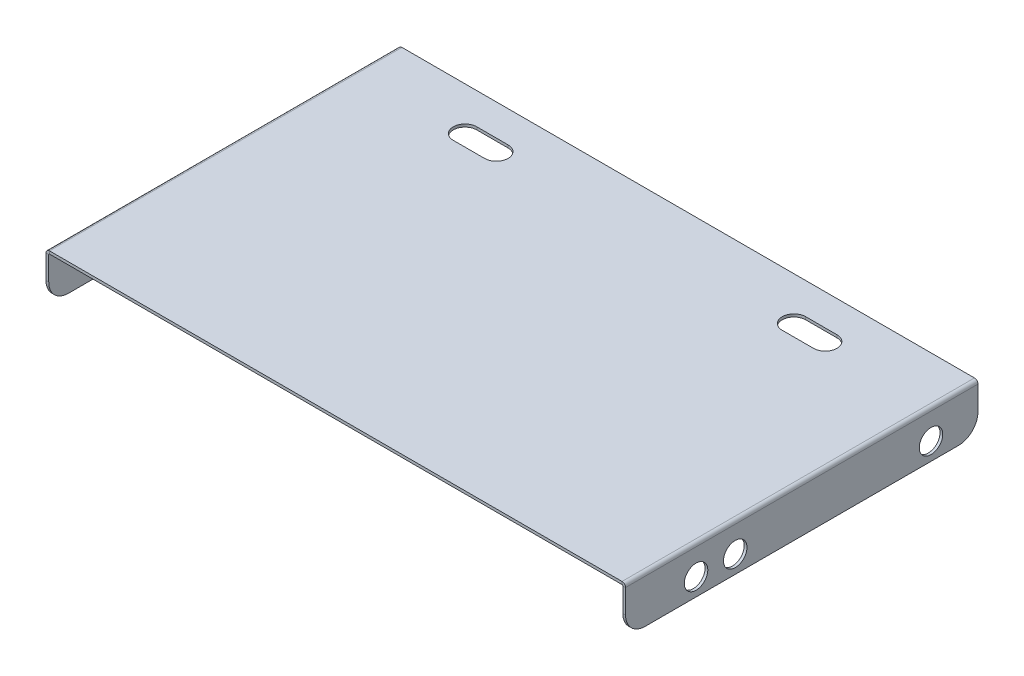
ISO-10303-21;
HEADER;
FILE_DESCRIPTION(('STEP AP214'),'2;1');
FILE_NAME('part.step','',(''),(''),'','','');
FILE_SCHEMA(('AUTOMOTIVE_DESIGN { 1 0 10303 214 1 1 1 1 }'));
ENDSEC;
DATA;
#1=APPLICATION_CONTEXT('core data for automotive mechanical design processes');
#2=APPLICATION_PROTOCOL_DEFINITION('international standard','automotive_design',2000,#1);
#3=PRODUCT_CONTEXT('',#1,'mechanical');
#4=PRODUCT('Part','Part','',(#3));
#5=PRODUCT_RELATED_PRODUCT_CATEGORY('part','',(#4));
#6=PRODUCT_DEFINITION_FORMATION('','',#4);
#7=PRODUCT_DEFINITION_CONTEXT('part definition',#1,'design');
#8=PRODUCT_DEFINITION('design','',#6,#7);
#9=PRODUCT_DEFINITION_SHAPE('','',#8);
#10=(LENGTH_UNIT() NAMED_UNIT(*) SI_UNIT(.MILLI.,.METRE.));
#11=(NAMED_UNIT(*) PLANE_ANGLE_UNIT() SI_UNIT($,.RADIAN.));
#12=(NAMED_UNIT(*) SI_UNIT($,.STERADIAN.) SOLID_ANGLE_UNIT());
#13=UNCERTAINTY_MEASURE_WITH_UNIT(LENGTH_MEASURE(1.E-05),#10,'distance_accuracy_value','');
#14=(GEOMETRIC_REPRESENTATION_CONTEXT(3) GLOBAL_UNCERTAINTY_ASSIGNED_CONTEXT((#13)) GLOBAL_UNIT_ASSIGNED_CONTEXT((#10,
#11,#12)) REPRESENTATION_CONTEXT('',''));
#15=CARTESIAN_POINT('',(0.,0.,0.));
#16=DIRECTION('',(0.,0.,1.));
#17=DIRECTION('',(1.,0.,0.));
#18=AXIS2_PLACEMENT_3D('',#15,#16,#17);
#19=CARTESIAN_POINT('',(0.,-0.7,0.));
#20=DIRECTION('',(0.,1.,0.));
#21=DIRECTION('',(0.,0.,1.));
#22=AXIS2_PLACEMENT_3D('',#19,#20,#21);
#23=PLANE('',#22);
#24=DIRECTION('',(-1.,0.,0.));
#25=VECTOR('',#24,1.);
#26=CARTESIAN_POINT('',(38.,-0.7,-37.));
#27=LINE('',#26,#25);
#28=CARTESIAN_POINT('',(46.,-0.7,-37.));
#29=VERTEX_POINT('',#28);
#30=CARTESIAN_POINT('',(38.,-0.7,-37.));
#31=VERTEX_POINT('',#30);
#32=EDGE_CURVE('E433',#29,#31,#27,.T.);
#33=ORIENTED_EDGE('',*,*,#32,.T.);
#34=CARTESIAN_POINT('',(38.,-0.7,-34.));
#35=DIRECTION('',(0.,1.,0.));
#36=DIRECTION('',(0.,0.,1.));
#37=AXIS2_PLACEMENT_3D('',#34,#35,#36);
#38=CIRCLE('',#37,3.);
#39=CARTESIAN_POINT('',(38.,-0.7,-31.));
#40=VERTEX_POINT('',#39);
#41=EDGE_CURVE('E420',#31,#40,#38,.T.);
#42=ORIENTED_EDGE('',*,*,#41,.T.);
#43=DIRECTION('',(1.,0.,0.));
#44=VECTOR('',#43,1.);
#45=CARTESIAN_POINT('',(38.,-0.7,-31.));
#46=LINE('',#45,#44);
#47=CARTESIAN_POINT('',(46.,-0.7,-31.));
#48=VERTEX_POINT('',#47);
#49=EDGE_CURVE('E424',#40,#48,#46,.T.);
#50=ORIENTED_EDGE('',*,*,#49,.T.);
#51=CARTESIAN_POINT('',(46.,-0.7,-34.));
#52=DIRECTION('',(0.,1.,0.));
#53=DIRECTION('',(0.,0.,1.));
#54=AXIS2_PLACEMENT_3D('',#51,#52,#53);
#55=CIRCLE('',#54,3.);
#56=EDGE_CURVE('E429',#48,#29,#55,.T.);
#57=ORIENTED_EDGE('',*,*,#56,.T.);
#58=EDGE_LOOP('',(#33,#42,#50,#57));
#59=FACE_BOUND('',#58,.T.);
#60=DIRECTION('',(-1.,0.,0.));
#61=VECTOR('',#60,1.);
#62=CARTESIAN_POINT('',(-46.,-0.7,-37.));
#63=LINE('',#62,#61);
#64=CARTESIAN_POINT('',(-38.,-0.7,-37.));
#65=VERTEX_POINT('',#64);
#66=CARTESIAN_POINT('',(-46.,-0.7,-37.));
#67=VERTEX_POINT('',#66);
#68=EDGE_CURVE('E477',#65,#67,#63,.T.);
#69=ORIENTED_EDGE('',*,*,#68,.T.);
#70=CARTESIAN_POINT('',(-46.,-0.7,-34.));
#71=DIRECTION('',(0.,1.,0.));
#72=DIRECTION('',(0.,0.,1.));
#73=AXIS2_PLACEMENT_3D('',#70,#71,#72);
#74=CIRCLE('',#73,3.00000000000001);
#75=CARTESIAN_POINT('',(-46.,-0.7,-31.));
#76=VERTEX_POINT('',#75);
#77=EDGE_CURVE('E464',#67,#76,#74,.T.);
#78=ORIENTED_EDGE('',*,*,#77,.T.);
#79=DIRECTION('',(1.,0.,0.));
#80=VECTOR('',#79,1.);
#81=CARTESIAN_POINT('',(-46.,-0.7,-31.));
#82=LINE('',#81,#80);
#83=CARTESIAN_POINT('',(-38.,-0.7,-31.));
#84=VERTEX_POINT('',#83);
#85=EDGE_CURVE('E468',#76,#84,#82,.T.);
#86=ORIENTED_EDGE('',*,*,#85,.T.);
#87=CARTESIAN_POINT('',(-38.,-0.7,-34.));
#88=DIRECTION('',(0.,1.,0.));
#89=DIRECTION('',(0.,0.,1.));
#90=AXIS2_PLACEMENT_3D('',#87,#88,#89);
#91=CIRCLE('',#90,3.00000000000001);
#92=EDGE_CURVE('E473',#84,#65,#91,.T.);
#93=ORIENTED_EDGE('',*,*,#92,.T.);
#94=EDGE_LOOP('',(#69,#78,#86,#93));
#95=FACE_BOUND('',#94,.T.);
#96=DIRECTION('',(0.,0.,-1.));
#97=VECTOR('',#96,1.);
#98=CARTESIAN_POINT('',(-73.1,-0.700000000000007,-45.));
#99=LINE('',#98,#97);
#100=CARTESIAN_POINT('',(-73.1,-0.700000000000007,-45.));
#101=VERTEX_POINT('',#100);
#102=CARTESIAN_POINT('',(-73.1,-0.700000000000007,45.));
#103=VERTEX_POINT('',#102);
#104=EDGE_CURVE('E316',#101,#103,#99,.F.);
#105=ORIENTED_EDGE('',*,*,#104,.F.);
#106=DIRECTION('',(-1.,0.,0.));
#107=VECTOR('',#106,1.);
#108=CARTESIAN_POINT('',(-74.,-0.7,-45.));
#109=LINE('',#108,#107);
#110=CARTESIAN_POINT('',(73.1,-0.700000000000021,-45.));
#111=VERTEX_POINT('',#110);
#112=EDGE_CURVE('E508',#111,#101,#109,.T.);
#113=ORIENTED_EDGE('',*,*,#112,.F.);
#114=DIRECTION('',(0.,0.,1.));
#115=VECTOR('',#114,1.);
#116=CARTESIAN_POINT('',(73.1,-0.700000000000021,45.));
#117=LINE('',#116,#115);
#118=CARTESIAN_POINT('',(73.1,-0.700000000000021,45.));
#119=VERTEX_POINT('',#118);
#120=EDGE_CURVE('E406',#119,#111,#117,.F.);
#121=ORIENTED_EDGE('',*,*,#120,.F.);
#122=DIRECTION('',(1.,0.,0.));
#123=VECTOR('',#122,1.);
#124=CARTESIAN_POINT('',(-74.,-0.7,45.));
#125=LINE('',#124,#123);
#126=EDGE_CURVE('E512',#103,#119,#125,.T.);
#127=ORIENTED_EDGE('',*,*,#126,.F.);
#128=EDGE_LOOP('',(#105,#113,#121,#127));
#129=FACE_BOUND('',#128,.T.);
#130=ADVANCED_FACE('F87',(#59,#95,#129),#23,.F.);
#131=CARTESIAN_POINT('',(0.,0.,0.));
#132=DIRECTION('',(0.,1.,0.));
#133=DIRECTION('',(0.,0.,1.));
#134=AXIS2_PLACEMENT_3D('',#131,#132,#133);
#135=PLANE('',#134);
#136=CARTESIAN_POINT('',(38.,0.,-34.));
#137=DIRECTION('',(0.,1.,0.));
#138=DIRECTION('',(0.,0.,1.));
#139=AXIS2_PLACEMENT_3D('',#136,#137,#138);
#140=CIRCLE('',#139,3.);
#141=CARTESIAN_POINT('',(38.,0.,-37.));
#142=VERTEX_POINT('',#141);
#143=CARTESIAN_POINT('',(38.,0.,-31.));
#144=VERTEX_POINT('',#143);
#145=EDGE_CURVE('E416',#142,#144,#140,.T.);
#146=ORIENTED_EDGE('',*,*,#145,.F.);
#147=DIRECTION('',(-1.,0.,0.));
#148=VECTOR('',#147,1.);
#149=CARTESIAN_POINT('',(38.,0.,-37.));
#150=LINE('',#149,#148);
#151=CARTESIAN_POINT('',(46.,0.,-37.));
#152=VERTEX_POINT('',#151);
#153=EDGE_CURVE('E425',#152,#142,#150,.T.);
#154=ORIENTED_EDGE('',*,*,#153,.F.);
#155=CARTESIAN_POINT('',(46.,0.,-34.));
#156=DIRECTION('',(0.,1.,0.));
#157=DIRECTION('',(0.,0.,1.));
#158=AXIS2_PLACEMENT_3D('',#155,#156,#157);
#159=CIRCLE('',#158,3.);
#160=CARTESIAN_POINT('',(46.,0.,-31.));
#161=VERTEX_POINT('',#160);
#162=EDGE_CURVE('E444',#161,#152,#159,.T.);
#163=ORIENTED_EDGE('',*,*,#162,.F.);
#164=DIRECTION('',(1.,0.,0.));
#165=VECTOR('',#164,1.);
#166=CARTESIAN_POINT('',(38.,0.,-31.));
#167=LINE('',#166,#165);
#168=EDGE_CURVE('E440',#144,#161,#167,.T.);
#169=ORIENTED_EDGE('',*,*,#168,.F.);
#170=EDGE_LOOP('',(#146,#154,#163,#169));
#171=FACE_BOUND('',#170,.T.);
#172=CARTESIAN_POINT('',(-46.,0.,-34.));
#173=DIRECTION('',(0.,1.,0.));
#174=DIRECTION('',(0.,0.,1.));
#175=AXIS2_PLACEMENT_3D('',#172,#173,#174);
#176=CIRCLE('',#175,3.00000000000001);
#177=CARTESIAN_POINT('',(-46.,0.,-37.));
#178=VERTEX_POINT('',#177);
#179=CARTESIAN_POINT('',(-46.,0.,-31.));
#180=VERTEX_POINT('',#179);
#181=EDGE_CURVE('E454',#178,#180,#176,.T.);
#182=ORIENTED_EDGE('',*,*,#181,.F.);
#183=DIRECTION('',(-1.,0.,0.));
#184=VECTOR('',#183,1.);
#185=CARTESIAN_POINT('',(-46.,0.,-37.));
#186=LINE('',#185,#184);
#187=CARTESIAN_POINT('',(-38.,0.,-37.));
#188=VERTEX_POINT('',#187);
#189=EDGE_CURVE('E469',#188,#178,#186,.T.);
#190=ORIENTED_EDGE('',*,*,#189,.F.);
#191=CARTESIAN_POINT('',(-38.,0.,-34.));
#192=DIRECTION('',(0.,1.,0.));
#193=DIRECTION('',(0.,0.,1.));
#194=AXIS2_PLACEMENT_3D('',#191,#192,#193);
#195=CIRCLE('',#194,3.00000000000001);
#196=CARTESIAN_POINT('',(-38.,0.,-31.));
#197=VERTEX_POINT('',#196);
#198=EDGE_CURVE('E488',#197,#188,#195,.T.);
#199=ORIENTED_EDGE('',*,*,#198,.F.);
#200=DIRECTION('',(1.,0.,0.));
#201=VECTOR('',#200,1.);
#202=CARTESIAN_POINT('',(-46.,0.,-31.));
#203=LINE('',#202,#201);
#204=EDGE_CURVE('E484',#180,#197,#203,.T.);
#205=ORIENTED_EDGE('',*,*,#204,.F.);
#206=EDGE_LOOP('',(#182,#190,#199,#205));
#207=FACE_BOUND('',#206,.T.);
#208=DIRECTION('',(-1.,0.,0.));
#209=VECTOR('',#208,1.);
#210=CARTESIAN_POINT('',(-74.,0.,-45.));
#211=LINE('',#210,#209);
#212=CARTESIAN_POINT('',(73.1,0.,-45.));
#213=VERTEX_POINT('',#212);
#214=CARTESIAN_POINT('',(-73.1,0.,-45.));
#215=VERTEX_POINT('',#214);
#216=EDGE_CURVE('E498',#213,#215,#211,.T.);
#217=ORIENTED_EDGE('',*,*,#216,.T.);
#218=DIRECTION('',(0.,0.,-1.));
#219=VECTOR('',#218,1.);
#220=CARTESIAN_POINT('',(-73.1,0.,-45.));
#221=LINE('',#220,#219);
#222=CARTESIAN_POINT('',(-73.1,0.,45.));
#223=VERTEX_POINT('',#222);
#224=EDGE_CURVE('E260',#215,#223,#221,.F.);
#225=ORIENTED_EDGE('',*,*,#224,.T.);
#226=DIRECTION('',(1.,0.,0.));
#227=VECTOR('',#226,1.);
#228=CARTESIAN_POINT('',(-74.,0.,45.));
#229=LINE('',#228,#227);
#230=CARTESIAN_POINT('',(73.1,0.,45.));
#231=VERTEX_POINT('',#230);
#232=EDGE_CURVE('E513',#223,#231,#229,.T.);
#233=ORIENTED_EDGE('',*,*,#232,.T.);
#234=DIRECTION('',(0.,0.,1.));
#235=VECTOR('',#234,1.);
#236=CARTESIAN_POINT('',(73.1,0.,45.));
#237=LINE('',#236,#235);
#238=EDGE_CURVE('E389',#231,#213,#237,.F.);
#239=ORIENTED_EDGE('',*,*,#238,.T.);
#240=EDGE_LOOP('',(#217,#225,#233,#239));
#241=FACE_BOUND('',#240,.T.);
#242=ADVANCED_FACE('F621',(#171,#207,#241),#135,.T.);
#243=CARTESIAN_POINT('',(-74.,-0.7,-45.));
#244=DIRECTION('',(0.,0.,-1.));
#245=DIRECTION('',(-1.,0.,0.));
#246=AXIS2_PLACEMENT_3D('',#243,#244,#245);
#247=PLANE('',#246);
#248=ORIENTED_EDGE('',*,*,#112,.T.);
#249=DIRECTION('',(0.,1.,0.));
#250=VECTOR('',#249,1.);
#251=CARTESIAN_POINT('',(-73.1,-0.700000000000007,-45.));
#252=LINE('',#251,#250);
#253=EDGE_CURVE('E311',#101,#215,#252,.T.);
#254=ORIENTED_EDGE('',*,*,#253,.T.);
#255=ORIENTED_EDGE('',*,*,#216,.F.);
#256=DIRECTION('',(0.,1.,0.));
#257=VECTOR('',#256,1.);
#258=CARTESIAN_POINT('',(73.1,-0.700000000000021,-45.));
#259=LINE('',#258,#257);
#260=EDGE_CURVE('E412',#111,#213,#259,.T.);
#261=ORIENTED_EDGE('',*,*,#260,.F.);
#262=EDGE_LOOP('',(#248,#254,#255,#261));
#263=FACE_BOUND('',#262,.T.);
#264=ADVANCED_FACE('F614',(#263),#247,.T.);
#265=CARTESIAN_POINT('',(-74.,-0.7,45.));
#266=DIRECTION('',(0.,0.,1.));
#267=DIRECTION('',(1.,0.,0.));
#268=AXIS2_PLACEMENT_3D('',#265,#266,#267);
#269=PLANE('',#268);
#270=DIRECTION('',(0.,1.,0.));
#271=VECTOR('',#270,1.);
#272=CARTESIAN_POINT('',(-73.1,-0.700000000000007,45.));
#273=LINE('',#272,#271);
#274=EDGE_CURVE('E321',#103,#223,#273,.T.);
#275=ORIENTED_EDGE('',*,*,#274,.F.);
#276=ORIENTED_EDGE('',*,*,#126,.T.);
#277=DIRECTION('',(0.,1.,0.));
#278=VECTOR('',#277,1.);
#279=CARTESIAN_POINT('',(73.1,-0.700000000000021,45.));
#280=LINE('',#279,#278);
#281=EDGE_CURVE('E398',#119,#231,#280,.T.);
#282=ORIENTED_EDGE('',*,*,#281,.T.);
#283=ORIENTED_EDGE('',*,*,#232,.F.);
#284=EDGE_LOOP('',(#275,#276,#282,#283));
#285=FACE_BOUND('',#284,.T.);
#286=ADVANCED_FACE('F684',(#285),#269,.T.);
#287=CARTESIAN_POINT('',(-46.,-0.7,-34.));
#288=DIRECTION('',(0.,1.,0.));
#289=DIRECTION('',(0.,0.,1.));
#290=AXIS2_PLACEMENT_3D('',#287,#288,#289);
#291=CYLINDRICAL_SURFACE('',#290,3.00000000000001);
#292=ORIENTED_EDGE('',*,*,#181,.T.);
#293=DIRECTION('',(0.,1.,0.));
#294=VECTOR('',#293,1.);
#295=CARTESIAN_POINT('',(-46.,-0.7,-31.));
#296=LINE('',#295,#294);
#297=EDGE_CURVE('E481',#76,#180,#296,.T.);
#298=ORIENTED_EDGE('',*,*,#297,.F.);
#299=ORIENTED_EDGE('',*,*,#77,.F.);
#300=DIRECTION('',(0.,1.,0.));
#301=VECTOR('',#300,1.);
#302=CARTESIAN_POINT('',(-46.,-0.7,-37.));
#303=LINE('',#302,#301);
#304=EDGE_CURVE('E495',#67,#178,#303,.T.);
#305=ORIENTED_EDGE('',*,*,#304,.T.);
#306=EDGE_LOOP('',(#292,#298,#299,#305));
#307=FACE_BOUND('',#306,.T.);
#308=ADVANCED_FACE('F681',(#307),#291,.F.);
#309=CARTESIAN_POINT('',(-46.,-0.7,-37.));
#310=DIRECTION('',(0.,0.,-1.));
#311=DIRECTION('',(-1.,0.,0.));
#312=AXIS2_PLACEMENT_3D('',#309,#310,#311);
#313=PLANE('',#312);
#314=ORIENTED_EDGE('',*,*,#189,.T.);
#315=ORIENTED_EDGE('',*,*,#304,.F.);
#316=ORIENTED_EDGE('',*,*,#68,.F.);
#317=DIRECTION('',(0.,1.,0.));
#318=VECTOR('',#317,1.);
#319=CARTESIAN_POINT('',(-38.,-0.7,-37.));
#320=LINE('',#319,#318);
#321=EDGE_CURVE('E499',#65,#188,#320,.T.);
#322=ORIENTED_EDGE('',*,*,#321,.T.);
#323=EDGE_LOOP('',(#314,#315,#316,#322));
#324=FACE_BOUND('',#323,.T.);
#325=ADVANCED_FACE('F798',(#324),#313,.F.);
#326=CARTESIAN_POINT('',(-38.,-0.7,-34.));
#327=DIRECTION('',(0.,1.,0.));
#328=DIRECTION('',(0.,0.,1.));
#329=AXIS2_PLACEMENT_3D('',#326,#327,#328);
#330=CYLINDRICAL_SURFACE('',#329,3.00000000000001);
#331=ORIENTED_EDGE('',*,*,#198,.T.);
#332=ORIENTED_EDGE('',*,*,#321,.F.);
#333=ORIENTED_EDGE('',*,*,#92,.F.);
#334=DIRECTION('',(0.,1.,0.));
#335=VECTOR('',#334,1.);
#336=CARTESIAN_POINT('',(-38.,-0.7,-31.));
#337=LINE('',#336,#335);
#338=EDGE_CURVE('E502',#84,#197,#337,.T.);
#339=ORIENTED_EDGE('',*,*,#338,.T.);
#340=EDGE_LOOP('',(#331,#332,#333,#339));
#341=FACE_BOUND('',#340,.T.);
#342=ADVANCED_FACE('F801',(#341),#330,.F.);
#343=CARTESIAN_POINT('',(-46.,-0.7,-31.));
#344=DIRECTION('',(0.,0.,1.));
#345=DIRECTION('',(1.,0.,0.));
#346=AXIS2_PLACEMENT_3D('',#343,#344,#345);
#347=PLANE('',#346);
#348=ORIENTED_EDGE('',*,*,#204,.T.);
#349=ORIENTED_EDGE('',*,*,#338,.F.);
#350=ORIENTED_EDGE('',*,*,#85,.F.);
#351=ORIENTED_EDGE('',*,*,#297,.T.);
#352=EDGE_LOOP('',(#348,#349,#350,#351));
#353=FACE_BOUND('',#352,.T.);
#354=ADVANCED_FACE('F796',(#353),#347,.F.);
#355=CARTESIAN_POINT('',(38.,-0.7,-34.));
#356=DIRECTION('',(0.,1.,0.));
#357=DIRECTION('',(0.,0.,1.));
#358=AXIS2_PLACEMENT_3D('',#355,#356,#357);
#359=CYLINDRICAL_SURFACE('',#358,3.);
#360=ORIENTED_EDGE('',*,*,#145,.T.);
#361=DIRECTION('',(0.,1.,0.));
#362=VECTOR('',#361,1.);
#363=CARTESIAN_POINT('',(38.,-0.7,-31.));
#364=LINE('',#363,#362);
#365=EDGE_CURVE('E437',#40,#144,#364,.T.);
#366=ORIENTED_EDGE('',*,*,#365,.F.);
#367=ORIENTED_EDGE('',*,*,#41,.F.);
#368=DIRECTION('',(0.,1.,0.));
#369=VECTOR('',#368,1.);
#370=CARTESIAN_POINT('',(38.,-0.7,-37.));
#371=LINE('',#370,#369);
#372=EDGE_CURVE('E451',#31,#142,#371,.T.);
#373=ORIENTED_EDGE('',*,*,#372,.T.);
#374=EDGE_LOOP('',(#360,#366,#367,#373));
#375=FACE_BOUND('',#374,.T.);
#376=ADVANCED_FACE('F786',(#375),#359,.F.);
#377=CARTESIAN_POINT('',(38.,-0.7,-37.));
#378=DIRECTION('',(0.,0.,-1.));
#379=DIRECTION('',(-1.,0.,0.));
#380=AXIS2_PLACEMENT_3D('',#377,#378,#379);
#381=PLANE('',#380);
#382=ORIENTED_EDGE('',*,*,#153,.T.);
#383=ORIENTED_EDGE('',*,*,#372,.F.);
#384=ORIENTED_EDGE('',*,*,#32,.F.);
#385=DIRECTION('',(0.,1.,0.));
#386=VECTOR('',#385,1.);
#387=CARTESIAN_POINT('',(46.,-0.7,-37.));
#388=LINE('',#387,#386);
#389=EDGE_CURVE('E455',#29,#152,#388,.T.);
#390=ORIENTED_EDGE('',*,*,#389,.T.);
#391=EDGE_LOOP('',(#382,#383,#384,#390));
#392=FACE_BOUND('',#391,.T.);
#393=ADVANCED_FACE('F782',(#392),#381,.F.);
#394=CARTESIAN_POINT('',(46.,-0.7,-34.));
#395=DIRECTION('',(0.,1.,0.));
#396=DIRECTION('',(0.,0.,1.));
#397=AXIS2_PLACEMENT_3D('',#394,#395,#396);
#398=CYLINDRICAL_SURFACE('',#397,3.);
#399=ORIENTED_EDGE('',*,*,#162,.T.);
#400=ORIENTED_EDGE('',*,*,#389,.F.);
#401=ORIENTED_EDGE('',*,*,#56,.F.);
#402=DIRECTION('',(0.,1.,0.));
#403=VECTOR('',#402,1.);
#404=CARTESIAN_POINT('',(46.,-0.7,-31.));
#405=LINE('',#404,#403);
#406=EDGE_CURVE('E458',#48,#161,#405,.T.);
#407=ORIENTED_EDGE('',*,*,#406,.T.);
#408=EDGE_LOOP('',(#399,#400,#401,#407));
#409=FACE_BOUND('',#408,.T.);
#410=ADVANCED_FACE('F785',(#409),#398,.F.);
#411=CARTESIAN_POINT('',(38.,-0.7,-31.));
#412=DIRECTION('',(0.,0.,1.));
#413=DIRECTION('',(1.,0.,0.));
#414=AXIS2_PLACEMENT_3D('',#411,#412,#413);
#415=PLANE('',#414);
#416=ORIENTED_EDGE('',*,*,#168,.T.);
#417=ORIENTED_EDGE('',*,*,#406,.F.);
#418=ORIENTED_EDGE('',*,*,#49,.F.);
#419=ORIENTED_EDGE('',*,*,#365,.T.);
#420=EDGE_LOOP('',(#416,#417,#418,#419));
#421=FACE_BOUND('',#420,.T.);
#422=ADVANCED_FACE('F779',(#421),#415,.F.);
#423=CARTESIAN_POINT('',(73.1,-0.900000000000012,-45.));
#424=DIRECTION('',(0.,0.,-1.));
#425=DIRECTION('',(-1.,0.,0.));
#426=AXIS2_PLACEMENT_3D('',#423,#424,#425);
#427=PLANE('',#426);
#428=DIRECTION('',(-1.,0.,0.));
#429=VECTOR('',#428,1.);
#430=CARTESIAN_POINT('',(74.,-0.90000000000001,-45.));
#431=LINE('',#430,#429);
#432=CARTESIAN_POINT('',(73.3,-0.900000000000012,-45.));
#433=VERTEX_POINT('',#432);
#434=CARTESIAN_POINT('',(74.,-0.90000000000001,-45.));
#435=VERTEX_POINT('',#434);
#436=EDGE_CURVE('E325',#433,#435,#431,.F.);
#437=ORIENTED_EDGE('',*,*,#436,.F.);
#438=CARTESIAN_POINT('',(73.1,-0.900000000000012,-45.));
#439=DIRECTION('',(0.,0.,1.));
#440=DIRECTION('',(1.,0.,0.));
#441=AXIS2_PLACEMENT_3D('',#438,#439,#440);
#442=CIRCLE('',#441,0.199999999999992);
#443=EDGE_CURVE('E402',#111,#433,#442,.F.);
#444=ORIENTED_EDGE('',*,*,#443,.F.);
#445=ORIENTED_EDGE('',*,*,#260,.T.);
#446=CARTESIAN_POINT('',(73.1,-0.900000000000012,-45.));
#447=DIRECTION('',(0.,0.,1.));
#448=DIRECTION('',(1.,0.,0.));
#449=AXIS2_PLACEMENT_3D('',#446,#447,#448);
#450=CIRCLE('',#449,0.899999999999992);
#451=EDGE_CURVE('E393',#213,#435,#450,.F.);
#452=ORIENTED_EDGE('',*,*,#451,.T.);
#453=EDGE_LOOP('',(#437,#444,#445,#452));
#454=FACE_BOUND('',#453,.T.);
#455=ADVANCED_FACE('F619',(#454),#427,.T.);
#456=CARTESIAN_POINT('',(73.1,-0.900000000000012,45.));
#457=DIRECTION('',(0.,0.,-1.));
#458=DIRECTION('',(-1.,0.,0.));
#459=AXIS2_PLACEMENT_3D('',#456,#457,#458);
#460=PLANE('',#459);
#461=CARTESIAN_POINT('',(73.1,-0.900000000000012,45.));
#462=DIRECTION('',(0.,0.,1.));
#463=DIRECTION('',(1.,0.,0.));
#464=AXIS2_PLACEMENT_3D('',#461,#462,#463);
#465=CIRCLE('',#464,0.199999999999992);
#466=CARTESIAN_POINT('',(73.3,-0.900000000000012,45.));
#467=VERTEX_POINT('',#466);
#468=EDGE_CURVE('E331',#467,#119,#465,.T.);
#469=ORIENTED_EDGE('',*,*,#468,.F.);
#470=DIRECTION('',(-1.,0.,0.));
#471=VECTOR('',#470,1.);
#472=CARTESIAN_POINT('',(73.3,-0.900000000000012,45.));
#473=LINE('',#472,#471);
#474=CARTESIAN_POINT('',(74.,-0.90000000000001,45.));
#475=VERTEX_POINT('',#474);
#476=EDGE_CURVE('E379',#467,#475,#473,.F.);
#477=ORIENTED_EDGE('',*,*,#476,.T.);
#478=CARTESIAN_POINT('',(73.1,-0.900000000000012,45.));
#479=DIRECTION('',(0.,0.,1.));
#480=DIRECTION('',(1.,0.,0.));
#481=AXIS2_PLACEMENT_3D('',#478,#479,#480);
#482=CIRCLE('',#481,0.899999999999992);
#483=EDGE_CURVE('E394',#475,#231,#482,.T.);
#484=ORIENTED_EDGE('',*,*,#483,.T.);
#485=ORIENTED_EDGE('',*,*,#281,.F.);
#486=EDGE_LOOP('',(#469,#477,#484,#485));
#487=FACE_BOUND('',#486,.T.);
#488=ADVANCED_FACE('F627',(#487),#460,.F.);
#489=CARTESIAN_POINT('',(73.1,-0.900000000000012,45.));
#490=DIRECTION('',(0.,0.,1.));
#491=DIRECTION('',(1.,0.,0.));
#492=AXIS2_PLACEMENT_3D('',#489,#490,#491);
#493=CYLINDRICAL_SURFACE('',#492,0.899999999999992);
#494=ORIENTED_EDGE('',*,*,#238,.F.);
#495=ORIENTED_EDGE('',*,*,#483,.F.);
#496=DIRECTION('',(0.,0.,1.));
#497=VECTOR('',#496,1.);
#498=CARTESIAN_POINT('',(74.,-0.90000000000001,-45.));
#499=LINE('',#498,#497);
#500=EDGE_CURVE('E375',#475,#435,#499,.F.);
#501=ORIENTED_EDGE('',*,*,#500,.T.);
#502=ORIENTED_EDGE('',*,*,#451,.F.);
#503=EDGE_LOOP('',(#494,#495,#501,#502));
#504=FACE_BOUND('',#503,.T.);
#505=ADVANCED_FACE('F624',(#504),#493,.T.);
#506=CARTESIAN_POINT('',(73.1,-0.900000000000012,45.));
#507=DIRECTION('',(0.,0.,1.));
#508=DIRECTION('',(1.,0.,0.));
#509=AXIS2_PLACEMENT_3D('',#506,#507,#508);
#510=CYLINDRICAL_SURFACE('',#509,0.199999999999992);
#511=ORIENTED_EDGE('',*,*,#120,.T.);
#512=ORIENTED_EDGE('',*,*,#443,.T.);
#513=DIRECTION('',(0.,0.,1.));
#514=VECTOR('',#513,1.);
#515=CARTESIAN_POINT('',(73.3,-0.900000000000012,-45.));
#516=LINE('',#515,#514);
#517=EDGE_CURVE('E383',#433,#467,#516,.T.);
#518=ORIENTED_EDGE('',*,*,#517,.T.);
#519=ORIENTED_EDGE('',*,*,#468,.T.);
#520=EDGE_LOOP('',(#511,#512,#518,#519));
#521=FACE_BOUND('',#520,.T.);
#522=ADVANCED_FACE('F656',(#521),#510,.F.);
#523=CARTESIAN_POINT('',(74.,1.84206213535114E-13,0.));
#524=DIRECTION('',(-1.,0.,0.));
#525=DIRECTION('',(0.,-1.,0.));
#526=AXIS2_PLACEMENT_3D('',#523,#524,#525);
#527=PLANE('',#526);
#528=CARTESIAN_POINT('',(74.,-7.5,27.));
#529=DIRECTION('',(-1.,0.,0.));
#530=DIRECTION('',(0.,-1.,0.));
#531=AXIS2_PLACEMENT_3D('',#528,#529,#530);
#532=CIRCLE('',#531,3.);
#533=CARTESIAN_POINT('',(74.,-10.5,27.));
#534=VERTEX_POINT('',#533);
#535=EDGE_CURVE('E367',#534,#534,#532,.F.);
#536=ORIENTED_EDGE('',*,*,#535,.F.);
#537=EDGE_LOOP('',(#536));
#538=FACE_BOUND('',#537,.T.);
#539=CARTESIAN_POINT('',(74.,-7.5,17.));
#540=DIRECTION('',(-1.,0.,0.));
#541=DIRECTION('',(0.,-1.,0.));
#542=AXIS2_PLACEMENT_3D('',#539,#540,#541);
#543=CIRCLE('',#542,3.);
#544=CARTESIAN_POINT('',(74.,-10.5,17.));
#545=VERTEX_POINT('',#544);
#546=EDGE_CURVE('E359',#545,#545,#543,.F.);
#547=ORIENTED_EDGE('',*,*,#546,.F.);
#548=EDGE_LOOP('',(#547));
#549=FACE_BOUND('',#548,.T.);
#550=CARTESIAN_POINT('',(74.,-7.5,-33.));
#551=DIRECTION('',(-1.,0.,0.));
#552=DIRECTION('',(0.,-1.,0.));
#553=AXIS2_PLACEMENT_3D('',#550,#551,#552);
#554=CIRCLE('',#553,3.);
#555=CARTESIAN_POINT('',(74.,-10.5,-33.));
#556=VERTEX_POINT('',#555);
#557=EDGE_CURVE('E351',#556,#556,#554,.F.);
#558=ORIENTED_EDGE('',*,*,#557,.F.);
#559=EDGE_LOOP('',(#558));
#560=FACE_BOUND('',#559,.T.);
#561=DIRECTION('',(0.,0.,-1.));
#562=VECTOR('',#561,1.);
#563=CARTESIAN_POINT('',(74.,-12.,0.));
#564=LINE('',#563,#562);
#565=CARTESIAN_POINT('',(74.,-12.,40.));
#566=VERTEX_POINT('',#565);
#567=CARTESIAN_POINT('',(74.,-12.,-40.));
#568=VERTEX_POINT('',#567);
#569=EDGE_CURVE('E332',#566,#568,#564,.T.);
#570=ORIENTED_EDGE('',*,*,#569,.T.);
#571=CARTESIAN_POINT('',(74.,-7.,-40.));
#572=DIRECTION('',(-1.,0.,0.));
#573=DIRECTION('',(0.,-1.,0.));
#574=AXIS2_PLACEMENT_3D('',#571,#572,#573);
#575=CIRCLE('',#574,5.);
#576=CARTESIAN_POINT('',(74.,-7.,-45.));
#577=VERTEX_POINT('',#576);
#578=EDGE_CURVE('E543',#568,#577,#575,.F.);
#579=ORIENTED_EDGE('',*,*,#578,.T.);
#580=DIRECTION('',(0.,1.,0.));
#581=VECTOR('',#580,1.);
#582=CARTESIAN_POINT('',(74.,1.84206213535114E-13,-45.));
#583=LINE('',#582,#581);
#584=EDGE_CURVE('E328',#577,#435,#583,.T.);
#585=ORIENTED_EDGE('',*,*,#584,.T.);
#586=ORIENTED_EDGE('',*,*,#500,.F.);
#587=DIRECTION('',(0.,-1.,0.));
#588=VECTOR('',#587,1.);
#589=CARTESIAN_POINT('',(74.,1.84206213535114E-13,45.));
#590=LINE('',#589,#588);
#591=CARTESIAN_POINT('',(74.,-7.,45.));
#592=VERTEX_POINT('',#591);
#593=EDGE_CURVE('E336',#475,#592,#590,.T.);
#594=ORIENTED_EDGE('',*,*,#593,.T.);
#595=CARTESIAN_POINT('',(74.,-7.,40.));
#596=DIRECTION('',(-1.,0.,0.));
#597=DIRECTION('',(0.,-1.,0.));
#598=AXIS2_PLACEMENT_3D('',#595,#596,#597);
#599=CIRCLE('',#598,5.);
#600=EDGE_CURVE('E540',#592,#566,#599,.F.);
#601=ORIENTED_EDGE('',*,*,#600,.T.);
#602=EDGE_LOOP('',(#570,#579,#585,#586,#594,#601));
#603=FACE_BOUND('',#602,.T.);
#604=ADVANCED_FACE('F634',(#538,#549,#560,#603),#527,.F.);
#605=CARTESIAN_POINT('',(73.3,1.81762176597924E-13,0.));
#606=DIRECTION('',(-1.,0.,0.));
#607=DIRECTION('',(0.,-1.,0.));
#608=AXIS2_PLACEMENT_3D('',#605,#606,#607);
#609=PLANE('',#608);
#610=CARTESIAN_POINT('',(73.3,-7.5,17.));
#611=DIRECTION('',(-1.,0.,0.));
#612=DIRECTION('',(0.,-1.,0.));
#613=AXIS2_PLACEMENT_3D('',#610,#611,#612);
#614=CIRCLE('',#613,3.);
#615=CARTESIAN_POINT('',(73.3,-10.5,17.));
#616=VERTEX_POINT('',#615);
#617=EDGE_CURVE('E363',#616,#616,#614,.F.);
#618=ORIENTED_EDGE('',*,*,#617,.T.);
#619=EDGE_LOOP('',(#618));
#620=FACE_BOUND('',#619,.T.);
#621=CARTESIAN_POINT('',(73.3,-7.5,-33.));
#622=DIRECTION('',(-1.,0.,0.));
#623=DIRECTION('',(0.,-1.,0.));
#624=AXIS2_PLACEMENT_3D('',#621,#622,#623);
#625=CIRCLE('',#624,3.);
#626=CARTESIAN_POINT('',(73.3,-10.5,-33.));
#627=VERTEX_POINT('',#626);
#628=EDGE_CURVE('E355',#627,#627,#625,.F.);
#629=ORIENTED_EDGE('',*,*,#628,.T.);
#630=EDGE_LOOP('',(#629));
#631=FACE_BOUND('',#630,.T.);
#632=CARTESIAN_POINT('',(73.3,-7.5,27.));
#633=DIRECTION('',(-1.,0.,0.));
#634=DIRECTION('',(0.,-1.,0.));
#635=AXIS2_PLACEMENT_3D('',#632,#633,#634);
#636=CIRCLE('',#635,3.);
#637=CARTESIAN_POINT('',(73.3,-10.5,27.));
#638=VERTEX_POINT('',#637);
#639=EDGE_CURVE('E371',#638,#638,#636,.F.);
#640=ORIENTED_EDGE('',*,*,#639,.T.);
#641=EDGE_LOOP('',(#640));
#642=FACE_BOUND('',#641,.T.);
#643=DIRECTION('',(0.,-1.,0.));
#644=VECTOR('',#643,1.);
#645=CARTESIAN_POINT('',(73.3,-0.699999999999999,-45.));
#646=LINE('',#645,#644);
#647=CARTESIAN_POINT('',(73.3,-7.,-45.));
#648=VERTEX_POINT('',#647);
#649=EDGE_CURVE('E340',#648,#433,#646,.F.);
#650=ORIENTED_EDGE('',*,*,#649,.F.);
#651=CARTESIAN_POINT('',(73.3,-7.,-40.));
#652=DIRECTION('',(-1.,0.,0.));
#653=DIRECTION('',(0.,-1.,0.));
#654=AXIS2_PLACEMENT_3D('',#651,#652,#653);
#655=CIRCLE('',#654,5.);
#656=CARTESIAN_POINT('',(73.3,-12.,-40.));
#657=VERTEX_POINT('',#656);
#658=EDGE_CURVE('E530',#648,#657,#655,.T.);
#659=ORIENTED_EDGE('',*,*,#658,.T.);
#660=DIRECTION('',(0.,0.,1.));
#661=VECTOR('',#660,1.);
#662=CARTESIAN_POINT('',(73.3,-12.,-45.));
#663=LINE('',#662,#661);
#664=CARTESIAN_POINT('',(73.3,-12.,40.));
#665=VERTEX_POINT('',#664);
#666=EDGE_CURVE('E343',#665,#657,#663,.F.);
#667=ORIENTED_EDGE('',*,*,#666,.F.);
#668=CARTESIAN_POINT('',(73.3,-7.,40.));
#669=DIRECTION('',(-1.,0.,0.));
#670=DIRECTION('',(0.,-1.,0.));
#671=AXIS2_PLACEMENT_3D('',#668,#669,#670);
#672=CIRCLE('',#671,5.);
#673=CARTESIAN_POINT('',(73.3,-7.,45.));
#674=VERTEX_POINT('',#673);
#675=EDGE_CURVE('E527',#665,#674,#672,.T.);
#676=ORIENTED_EDGE('',*,*,#675,.T.);
#677=DIRECTION('',(0.,1.,0.));
#678=VECTOR('',#677,1.);
#679=CARTESIAN_POINT('',(73.3,-12.,45.));
#680=LINE('',#679,#678);
#681=EDGE_CURVE('E347',#467,#674,#680,.F.);
#682=ORIENTED_EDGE('',*,*,#681,.F.);
#683=ORIENTED_EDGE('',*,*,#517,.F.);
#684=EDGE_LOOP('',(#650,#659,#667,#676,#682,#683));
#685=FACE_BOUND('',#684,.T.);
#686=ADVANCED_FACE('F658',(#620,#631,#642,#685),#609,.T.);
#687=CARTESIAN_POINT('',(74.,-12.,45.));
#688=DIRECTION('',(0.,0.,-1.));
#689=DIRECTION('',(-1.,0.,0.));
#690=AXIS2_PLACEMENT_3D('',#687,#688,#689);
#691=PLANE('',#690);
#692=ORIENTED_EDGE('',*,*,#681,.T.);
#693=DIRECTION('',(-1.,0.,0.));
#694=VECTOR('',#693,1.);
#695=CARTESIAN_POINT('',(74.,-7.,45.));
#696=LINE('',#695,#694);
#697=EDGE_CURVE('E546',#674,#592,#696,.F.);
#698=ORIENTED_EDGE('',*,*,#697,.T.);
#699=ORIENTED_EDGE('',*,*,#593,.F.);
#700=ORIENTED_EDGE('',*,*,#476,.F.);
#701=EDGE_LOOP('',(#692,#698,#699,#700));
#702=FACE_BOUND('',#701,.T.);
#703=ADVANCED_FACE('F637',(#702),#691,.F.);
#704=CARTESIAN_POINT('',(74.,-0.699999999999998,-45.));
#705=DIRECTION('',(0.,0.,1.));
#706=DIRECTION('',(1.,0.,0.));
#707=AXIS2_PLACEMENT_3D('',#704,#705,#706);
#708=PLANE('',#707);
#709=ORIENTED_EDGE('',*,*,#584,.F.);
#710=DIRECTION('',(-1.,0.,0.));
#711=VECTOR('',#710,1.);
#712=CARTESIAN_POINT('',(74.,-7.,-45.));
#713=LINE('',#712,#711);
#714=EDGE_CURVE('E517',#577,#648,#713,.T.);
#715=ORIENTED_EDGE('',*,*,#714,.T.);
#716=ORIENTED_EDGE('',*,*,#649,.T.);
#717=ORIENTED_EDGE('',*,*,#436,.T.);
#718=EDGE_LOOP('',(#709,#715,#716,#717));
#719=FACE_BOUND('',#718,.T.);
#720=ADVANCED_FACE('F652',(#719),#708,.F.);
#721=CARTESIAN_POINT('',(74.,-12.,-45.));
#722=DIRECTION('',(0.,1.,0.));
#723=DIRECTION('',(-1.,0.,0.));
#724=AXIS2_PLACEMENT_3D('',#721,#722,#723);
#725=PLANE('',#724);
#726=ORIENTED_EDGE('',*,*,#666,.T.);
#727=DIRECTION('',(-1.,0.,0.));
#728=VECTOR('',#727,1.);
#729=CARTESIAN_POINT('',(74.,-12.,-40.));
#730=LINE('',#729,#728);
#731=EDGE_CURVE('E537',#657,#568,#730,.F.);
#732=ORIENTED_EDGE('',*,*,#731,.T.);
#733=ORIENTED_EDGE('',*,*,#569,.F.);
#734=DIRECTION('',(-1.,0.,0.));
#735=VECTOR('',#734,1.);
#736=CARTESIAN_POINT('',(74.,-12.,40.));
#737=LINE('',#736,#735);
#738=EDGE_CURVE('E533',#566,#665,#737,.T.);
#739=ORIENTED_EDGE('',*,*,#738,.T.);
#740=EDGE_LOOP('',(#726,#732,#733,#739));
#741=FACE_BOUND('',#740,.T.);
#742=ADVANCED_FACE('F645',(#741),#725,.F.);
#743=CARTESIAN_POINT('',(74.,-7.5,-33.));
#744=DIRECTION('',(-1.,0.,0.));
#745=DIRECTION('',(0.,-1.,0.));
#746=AXIS2_PLACEMENT_3D('',#743,#744,#745);
#747=CYLINDRICAL_SURFACE('',#746,3.);
#748=ORIENTED_EDGE('',*,*,#557,.T.);
#749=EDGE_LOOP('',(#748));
#750=FACE_BOUND('',#749,.T.);
#751=ORIENTED_EDGE('',*,*,#628,.F.);
#752=EDGE_LOOP('',(#751));
#753=FACE_BOUND('',#752,.T.);
#754=ADVANCED_FACE('F754',(#750,#753),#747,.F.);
#755=CARTESIAN_POINT('',(74.,-7.5,17.));
#756=DIRECTION('',(-1.,0.,0.));
#757=DIRECTION('',(0.,-1.,0.));
#758=AXIS2_PLACEMENT_3D('',#755,#756,#757);
#759=CYLINDRICAL_SURFACE('',#758,3.);
#760=ORIENTED_EDGE('',*,*,#546,.T.);
#761=EDGE_LOOP('',(#760));
#762=FACE_BOUND('',#761,.T.);
#763=ORIENTED_EDGE('',*,*,#617,.F.);
#764=EDGE_LOOP('',(#763));
#765=FACE_BOUND('',#764,.T.);
#766=ADVANCED_FACE('F750',(#762,#765),#759,.F.);
#767=CARTESIAN_POINT('',(74.,-7.5,27.));
#768=DIRECTION('',(-1.,0.,0.));
#769=DIRECTION('',(0.,-1.,0.));
#770=AXIS2_PLACEMENT_3D('',#767,#768,#769);
#771=CYLINDRICAL_SURFACE('',#770,3.);
#772=ORIENTED_EDGE('',*,*,#535,.T.);
#773=EDGE_LOOP('',(#772));
#774=FACE_BOUND('',#773,.T.);
#775=ORIENTED_EDGE('',*,*,#639,.F.);
#776=EDGE_LOOP('',(#775));
#777=FACE_BOUND('',#776,.T.);
#778=ADVANCED_FACE('F745',(#774,#777),#771,.F.);
#779=CARTESIAN_POINT('',(-73.1,-0.900000000000013,45.));
#780=DIRECTION('',(0.,0.,1.));
#781=DIRECTION('',(1.,0.,0.));
#782=AXIS2_PLACEMENT_3D('',#779,#780,#781);
#783=PLANE('',#782);
#784=DIRECTION('',(1.,0.,0.));
#785=VECTOR('',#784,1.);
#786=CARTESIAN_POINT('',(-74.,-0.900000000000009,45.));
#787=LINE('',#786,#785);
#788=CARTESIAN_POINT('',(-73.3,-0.900000000000012,45.));
#789=VERTEX_POINT('',#788);
#790=CARTESIAN_POINT('',(-74.,-0.900000000000009,45.));
#791=VERTEX_POINT('',#790);
#792=EDGE_CURVE('E303',#789,#791,#787,.F.);
#793=ORIENTED_EDGE('',*,*,#792,.F.);
#794=CARTESIAN_POINT('',(-73.1,-0.900000000000013,45.));
#795=DIRECTION('',(0.,0.,-1.));
#796=DIRECTION('',(-1.,0.,0.));
#797=AXIS2_PLACEMENT_3D('',#794,#795,#796);
#798=CIRCLE('',#797,0.200000000000006);
#799=EDGE_CURVE('E264',#103,#789,#798,.F.);
#800=ORIENTED_EDGE('',*,*,#799,.F.);
#801=ORIENTED_EDGE('',*,*,#274,.T.);
#802=CARTESIAN_POINT('',(-73.1,-0.900000000000013,45.));
#803=DIRECTION('',(0.,0.,-1.));
#804=DIRECTION('',(-1.,0.,0.));
#805=AXIS2_PLACEMENT_3D('',#802,#803,#804);
#806=CIRCLE('',#805,0.900000000000006);
#807=EDGE_CURVE('E309',#223,#791,#806,.F.);
#808=ORIENTED_EDGE('',*,*,#807,.T.);
#809=EDGE_LOOP('',(#793,#800,#801,#808));
#810=FACE_BOUND('',#809,.T.);
#811=ADVANCED_FACE('F603',(#810),#783,.T.);
#812=CARTESIAN_POINT('',(-73.1,-0.900000000000013,-45.));
#813=DIRECTION('',(0.,0.,1.));
#814=DIRECTION('',(1.,0.,0.));
#815=AXIS2_PLACEMENT_3D('',#812,#813,#814);
#816=PLANE('',#815);
#817=CARTESIAN_POINT('',(-73.1,-0.900000000000013,-45.));
#818=DIRECTION('',(0.,0.,-1.));
#819=DIRECTION('',(-1.,0.,0.));
#820=AXIS2_PLACEMENT_3D('',#817,#818,#819);
#821=CIRCLE('',#820,0.200000000000006);
#822=CARTESIAN_POINT('',(-73.3,-0.900000000000012,-45.));
#823=VERTEX_POINT('',#822);
#824=EDGE_CURVE('E271',#823,#101,#821,.T.);
#825=ORIENTED_EDGE('',*,*,#824,.F.);
#826=DIRECTION('',(1.,0.,0.));
#827=VECTOR('',#826,1.);
#828=CARTESIAN_POINT('',(-73.3,-0.900000000000012,-45.));
#829=LINE('',#828,#827);
#830=CARTESIAN_POINT('',(-74.,-0.900000000000009,-45.));
#831=VERTEX_POINT('',#830);
#832=EDGE_CURVE('E268',#823,#831,#829,.F.);
#833=ORIENTED_EDGE('',*,*,#832,.T.);
#834=CARTESIAN_POINT('',(-73.1,-0.900000000000013,-45.));
#835=DIRECTION('',(0.,0.,-1.));
#836=DIRECTION('',(-1.,0.,0.));
#837=AXIS2_PLACEMENT_3D('',#834,#835,#836);
#838=CIRCLE('',#837,0.900000000000006);
#839=EDGE_CURVE('E253',#831,#215,#838,.T.);
#840=ORIENTED_EDGE('',*,*,#839,.T.);
#841=ORIENTED_EDGE('',*,*,#253,.F.);
#842=EDGE_LOOP('',(#825,#833,#840,#841));
#843=FACE_BOUND('',#842,.T.);
#844=ADVANCED_FACE('F269',(#843),#816,.F.);
#845=CARTESIAN_POINT('',(-73.1,-0.900000000000013,-45.));
#846=DIRECTION('',(0.,0.,-1.));
#847=DIRECTION('',(-1.,0.,0.));
#848=AXIS2_PLACEMENT_3D('',#845,#846,#847);
#849=CYLINDRICAL_SURFACE('',#848,0.900000000000006);
#850=ORIENTED_EDGE('',*,*,#224,.F.);
#851=ORIENTED_EDGE('',*,*,#839,.F.);
#852=DIRECTION('',(0.,0.,-1.));
#853=VECTOR('',#852,1.);
#854=CARTESIAN_POINT('',(-74.,-0.900000000000009,45.));
#855=LINE('',#854,#853);
#856=EDGE_CURVE('E257',#831,#791,#855,.F.);
#857=ORIENTED_EDGE('',*,*,#856,.T.);
#858=ORIENTED_EDGE('',*,*,#807,.F.);
#859=EDGE_LOOP('',(#850,#851,#857,#858));
#860=FACE_BOUND('',#859,.T.);
#861=ADVANCED_FACE('F255',(#860),#849,.T.);
#862=CARTESIAN_POINT('',(-73.1,-0.900000000000013,-45.));
#863=DIRECTION('',(0.,0.,-1.));
#864=DIRECTION('',(-1.,0.,0.));
#865=AXIS2_PLACEMENT_3D('',#862,#863,#864);
#866=CYLINDRICAL_SURFACE('',#865,0.200000000000006);
#867=ORIENTED_EDGE('',*,*,#104,.T.);
#868=ORIENTED_EDGE('',*,*,#799,.T.);
#869=DIRECTION('',(0.,0.,-1.));
#870=VECTOR('',#869,1.);
#871=CARTESIAN_POINT('',(-73.3,-0.900000000000012,45.));
#872=LINE('',#871,#870);
#873=EDGE_CURVE('E274',#789,#823,#872,.T.);
#874=ORIENTED_EDGE('',*,*,#873,.T.);
#875=ORIENTED_EDGE('',*,*,#824,.T.);
#876=EDGE_LOOP('',(#867,#868,#874,#875));
#877=FACE_BOUND('',#876,.T.);
#878=ADVANCED_FACE('F606',(#877),#866,.F.);
#879=CARTESIAN_POINT('',(-74.,-12.,-45.));
#880=DIRECTION('',(0.,0.,1.));
#881=DIRECTION('',(1.,0.,0.));
#882=AXIS2_PLACEMENT_3D('',#879,#880,#881);
#883=PLANE('',#882);
#884=DIRECTION('',(0.,1.,0.));
#885=VECTOR('',#884,1.);
#886=CARTESIAN_POINT('',(-73.3,-12.,-45.));
#887=LINE('',#886,#885);
#888=CARTESIAN_POINT('',(-73.3,-7.,-45.));
#889=VERTEX_POINT('',#888);
#890=EDGE_CURVE('E283',#823,#889,#887,.F.);
#891=ORIENTED_EDGE('',*,*,#890,.T.);
#892=DIRECTION('',(1.,0.,0.));
#893=VECTOR('',#892,1.);
#894=CARTESIAN_POINT('',(-74.,-7.,-45.));
#895=LINE('',#894,#893);
#896=CARTESIAN_POINT('',(-74.,-7.,-45.));
#897=VERTEX_POINT('',#896);
#898=EDGE_CURVE('E13',#889,#897,#895,.F.);
#899=ORIENTED_EDGE('',*,*,#898,.T.);
#900=DIRECTION('',(0.,-1.,0.));
#901=VECTOR('',#900,1.);
#902=CARTESIAN_POINT('',(-74.,2.75087301834076E-13,-45.));
#903=LINE('',#902,#901);
#904=EDGE_CURVE('E278',#831,#897,#903,.T.);
#905=ORIENTED_EDGE('',*,*,#904,.F.);
#906=ORIENTED_EDGE('',*,*,#832,.F.);
#907=EDGE_LOOP('',(#891,#899,#905,#906));
#908=FACE_BOUND('',#907,.T.);
#909=ADVANCED_FACE('F285',(#908),#883,.F.);
#910=CARTESIAN_POINT('',(-74.,-0.699999999999998,45.));
#911=DIRECTION('',(0.,0.,-1.));
#912=DIRECTION('',(-1.,0.,0.));
#913=AXIS2_PLACEMENT_3D('',#910,#911,#912);
#914=PLANE('',#913);
#915=DIRECTION('',(0.,1.,0.));
#916=VECTOR('',#915,1.);
#917=CARTESIAN_POINT('',(-74.,2.75087301834076E-13,45.));
#918=LINE('',#917,#916);
#919=CARTESIAN_POINT('',(-74.,-7.,45.));
#920=VERTEX_POINT('',#919);
#921=EDGE_CURVE('E281',#920,#791,#918,.T.);
#922=ORIENTED_EDGE('',*,*,#921,.F.);
#923=DIRECTION('',(1.,0.,0.));
#924=VECTOR('',#923,1.);
#925=CARTESIAN_POINT('',(-74.,-7.,45.));
#926=LINE('',#925,#924);
#927=CARTESIAN_POINT('',(-73.3,-7.,45.));
#928=VERTEX_POINT('',#927);
#929=EDGE_CURVE('E549',#920,#928,#926,.T.);
#930=ORIENTED_EDGE('',*,*,#929,.T.);
#931=DIRECTION('',(0.,-1.,0.));
#932=VECTOR('',#931,1.);
#933=CARTESIAN_POINT('',(-73.3,-0.7,45.));
#934=LINE('',#933,#932);
#935=EDGE_CURVE('E288',#928,#789,#934,.F.);
#936=ORIENTED_EDGE('',*,*,#935,.T.);
#937=ORIENTED_EDGE('',*,*,#792,.T.);
#938=EDGE_LOOP('',(#922,#930,#936,#937));
#939=FACE_BOUND('',#938,.T.);
#940=ADVANCED_FACE('F599',(#939),#914,.F.);
#941=CARTESIAN_POINT('',(-74.,2.75087301834076E-13,0.));
#942=DIRECTION('',(1.,0.,0.));
#943=DIRECTION('',(0.,1.,0.));
#944=AXIS2_PLACEMENT_3D('',#941,#942,#943);
#945=PLANE('',#944);
#946=CARTESIAN_POINT('',(-74.,-7.49999999999946,-33.));
#947=DIRECTION('',(-1.,0.,0.));
#948=DIRECTION('',(0.,-1.,0.));
#949=AXIS2_PLACEMENT_3D('',#946,#947,#948);
#950=CIRCLE('',#949,3.);
#951=CARTESIAN_POINT('',(-74.,-10.4999999999995,-33.));
#952=VERTEX_POINT('',#951);
#953=EDGE_CURVE('E574',#952,#952,#950,.T.);
#954=ORIENTED_EDGE('',*,*,#953,.F.);
#955=EDGE_LOOP('',(#954));
#956=FACE_BOUND('',#955,.T.);
#957=CARTESIAN_POINT('',(-74.,-7.49999999999946,17.));
#958=DIRECTION('',(-1.,0.,0.));
#959=DIRECTION('',(0.,-1.,0.));
#960=AXIS2_PLACEMENT_3D('',#957,#958,#959);
#961=CIRCLE('',#960,3.);
#962=CARTESIAN_POINT('',(-74.,-10.4999999999995,17.));
#963=VERTEX_POINT('',#962);
#964=EDGE_CURVE('E708',#963,#963,#961,.T.);
#965=ORIENTED_EDGE('',*,*,#964,.F.);
#966=EDGE_LOOP('',(#965));
#967=FACE_BOUND('',#966,.T.);
#968=CARTESIAN_POINT('',(-74.,-7.49999999999946,27.));
#969=DIRECTION('',(-1.,0.,0.));
#970=DIRECTION('',(0.,-1.,0.));
#971=AXIS2_PLACEMENT_3D('',#968,#969,#970);
#972=CIRCLE('',#971,3.);
#973=CARTESIAN_POINT('',(-74.,-10.4999999999995,27.));
#974=VERTEX_POINT('',#973);
#975=EDGE_CURVE('E704',#974,#974,#972,.T.);
#976=ORIENTED_EDGE('',*,*,#975,.F.);
#977=EDGE_LOOP('',(#976));
#978=FACE_BOUND('',#977,.T.);
#979=DIRECTION('',(0.,0.,1.));
#980=VECTOR('',#979,1.);
#981=CARTESIAN_POINT('',(-74.,-12.,0.));
#982=LINE('',#981,#980);
#983=CARTESIAN_POINT('',(-74.,-12.,-40.));
#984=VERTEX_POINT('',#983);
#985=CARTESIAN_POINT('',(-74.,-12.,40.));
#986=VERTEX_POINT('',#985);
#987=EDGE_CURVE('E287',#984,#986,#982,.T.);
#988=ORIENTED_EDGE('',*,*,#987,.T.);
#989=CARTESIAN_POINT('',(-74.,-7.,40.));
#990=DIRECTION('',(1.,0.,0.));
#991=DIRECTION('',(0.,1.,0.));
#992=AXIS2_PLACEMENT_3D('',#989,#990,#991);
#993=CIRCLE('',#992,5.);
#994=EDGE_CURVE('E97',#986,#920,#993,.F.);
#995=ORIENTED_EDGE('',*,*,#994,.T.);
#996=ORIENTED_EDGE('',*,*,#921,.T.);
#997=ORIENTED_EDGE('',*,*,#856,.F.);
#998=ORIENTED_EDGE('',*,*,#904,.T.);
#999=CARTESIAN_POINT('',(-74.,-7.,-40.));
#1000=DIRECTION('',(1.,0.,0.));
#1001=DIRECTION('',(0.,1.,0.));
#1002=AXIS2_PLACEMENT_3D('',#999,#1000,#1001);
#1003=CIRCLE('',#1002,5.);
#1004=EDGE_CURVE('E565',#897,#984,#1003,.F.);
#1005=ORIENTED_EDGE('',*,*,#1004,.T.);
#1006=EDGE_LOOP('',(#988,#995,#996,#997,#998,#1005));
#1007=FACE_BOUND('',#1006,.T.);
#1008=ADVANCED_FACE('F277',(#956,#967,#978,#1007),#945,.F.);
#1009=CARTESIAN_POINT('',(-73.3,2.72643264896886E-13,0.));
#1010=DIRECTION('',(1.,0.,0.));
#1011=DIRECTION('',(0.,1.,0.));
#1012=AXIS2_PLACEMENT_3D('',#1009,#1010,#1011);
#1013=PLANE('',#1012);
#1014=CARTESIAN_POINT('',(-73.3,-7.49999999999946,-33.));
#1015=DIRECTION('',(1.,0.,0.));
#1016=DIRECTION('',(0.,1.,0.));
#1017=AXIS2_PLACEMENT_3D('',#1014,#1015,#1016);
#1018=CIRCLE('',#1017,3.);
#1019=CARTESIAN_POINT('',(-73.3,-4.49999999999946,-33.));
#1020=VERTEX_POINT('',#1019);
#1021=EDGE_CURVE('E91',#1020,#1020,#1018,.T.);
#1022=ORIENTED_EDGE('',*,*,#1021,.F.);
#1023=EDGE_LOOP('',(#1022));
#1024=FACE_BOUND('',#1023,.T.);
#1025=CARTESIAN_POINT('',(-73.3,-7.49999999999946,17.));
#1026=DIRECTION('',(1.,0.,0.));
#1027=DIRECTION('',(0.,1.,0.));
#1028=AXIS2_PLACEMENT_3D('',#1025,#1026,#1027);
#1029=CIRCLE('',#1028,3.);
#1030=CARTESIAN_POINT('',(-73.3,-4.49999999999946,17.));
#1031=VERTEX_POINT('',#1030);
#1032=EDGE_CURVE('E573',#1031,#1031,#1029,.T.);
#1033=ORIENTED_EDGE('',*,*,#1032,.F.);
#1034=EDGE_LOOP('',(#1033));
#1035=FACE_BOUND('',#1034,.T.);
#1036=CARTESIAN_POINT('',(-73.3,-7.49999999999946,27.));
#1037=DIRECTION('',(1.,0.,0.));
#1038=DIRECTION('',(0.,1.,0.));
#1039=AXIS2_PLACEMENT_3D('',#1036,#1037,#1038);
#1040=CIRCLE('',#1039,3.);
#1041=CARTESIAN_POINT('',(-73.3,-4.49999999999946,27.));
#1042=VERTEX_POINT('',#1041);
#1043=EDGE_CURVE('E570',#1042,#1042,#1040,.T.);
#1044=ORIENTED_EDGE('',*,*,#1043,.F.);
#1045=EDGE_LOOP('',(#1044));
#1046=FACE_BOUND('',#1045,.T.);
#1047=ORIENTED_EDGE('',*,*,#935,.F.);
#1048=CARTESIAN_POINT('',(-73.3,-7.,40.));
#1049=DIRECTION('',(1.,0.,0.));
#1050=DIRECTION('',(0.,1.,0.));
#1051=AXIS2_PLACEMENT_3D('',#1048,#1049,#1050);
#1052=CIRCLE('',#1051,5.);
#1053=CARTESIAN_POINT('',(-73.3,-12.,40.));
#1054=VERTEX_POINT('',#1053);
#1055=EDGE_CURVE('E556',#928,#1054,#1052,.T.);
#1056=ORIENTED_EDGE('',*,*,#1055,.T.);
#1057=DIRECTION('',(0.,0.,-1.));
#1058=VECTOR('',#1057,1.);
#1059=CARTESIAN_POINT('',(-73.3,-12.,45.));
#1060=LINE('',#1059,#1058);
#1061=CARTESIAN_POINT('',(-73.3,-12.,-40.));
#1062=VERTEX_POINT('',#1061);
#1063=EDGE_CURVE('E293',#1062,#1054,#1060,.F.);
#1064=ORIENTED_EDGE('',*,*,#1063,.F.);
#1065=CARTESIAN_POINT('',(-73.3,-7.,-40.));
#1066=DIRECTION('',(1.,0.,0.));
#1067=DIRECTION('',(0.,1.,0.));
#1068=AXIS2_PLACEMENT_3D('',#1065,#1066,#1067);
#1069=CIRCLE('',#1068,5.);
#1070=EDGE_CURVE('E553',#1062,#889,#1069,.T.);
#1071=ORIENTED_EDGE('',*,*,#1070,.T.);
#1072=ORIENTED_EDGE('',*,*,#890,.F.);
#1073=ORIENTED_EDGE('',*,*,#873,.F.);
#1074=EDGE_LOOP('',(#1047,#1056,#1064,#1071,#1072,#1073));
#1075=FACE_BOUND('',#1074,.T.);
#1076=ADVANCED_FACE('F586',(#1024,#1035,#1046,#1075),#1013,.T.);
#1077=CARTESIAN_POINT('',(-74.,-12.,45.));
#1078=DIRECTION('',(0.,1.,0.));
#1079=DIRECTION('',(-1.,0.,0.));
#1080=AXIS2_PLACEMENT_3D('',#1077,#1078,#1079);
#1081=PLANE('',#1080);
#1082=ORIENTED_EDGE('',*,*,#1063,.T.);
#1083=DIRECTION('',(1.,0.,0.));
#1084=VECTOR('',#1083,1.);
#1085=CARTESIAN_POINT('',(-74.,-12.,40.));
#1086=LINE('',#1085,#1084);
#1087=EDGE_CURVE('E111',#1054,#986,#1086,.F.);
#1088=ORIENTED_EDGE('',*,*,#1087,.T.);
#1089=ORIENTED_EDGE('',*,*,#987,.F.);
#1090=DIRECTION('',(1.,0.,0.));
#1091=VECTOR('',#1090,1.);
#1092=CARTESIAN_POINT('',(-74.,-12.,-40.));
#1093=LINE('',#1092,#1091);
#1094=EDGE_CURVE('E559',#984,#1062,#1093,.T.);
#1095=ORIENTED_EDGE('',*,*,#1094,.T.);
#1096=EDGE_LOOP('',(#1082,#1088,#1089,#1095));
#1097=FACE_BOUND('',#1096,.T.);
#1098=ADVANCED_FACE('F589',(#1097),#1081,.F.);
#1099=CARTESIAN_POINT('',(74.,-7.,-40.));
#1100=DIRECTION('',(-1.,0.,0.));
#1101=DIRECTION('',(0.,-1.,0.));
#1102=AXIS2_PLACEMENT_3D('',#1099,#1100,#1101);
#1103=CYLINDRICAL_SURFACE('',#1102,5.);
#1104=ORIENTED_EDGE('',*,*,#578,.F.);
#1105=ORIENTED_EDGE('',*,*,#731,.F.);
#1106=ORIENTED_EDGE('',*,*,#658,.F.);
#1107=ORIENTED_EDGE('',*,*,#714,.F.);
#1108=EDGE_LOOP('',(#1104,#1105,#1106,#1107));
#1109=FACE_BOUND('',#1108,.T.);
#1110=ADVANCED_FACE('F649',(#1109),#1103,.T.);
#1111=CARTESIAN_POINT('',(74.,-7.,40.));
#1112=DIRECTION('',(-1.,0.,0.));
#1113=DIRECTION('',(0.,-1.,0.));
#1114=AXIS2_PLACEMENT_3D('',#1111,#1112,#1113);
#1115=CYLINDRICAL_SURFACE('',#1114,5.);
#1116=ORIENTED_EDGE('',*,*,#600,.F.);
#1117=ORIENTED_EDGE('',*,*,#697,.F.);
#1118=ORIENTED_EDGE('',*,*,#675,.F.);
#1119=ORIENTED_EDGE('',*,*,#738,.F.);
#1120=EDGE_LOOP('',(#1116,#1117,#1118,#1119));
#1121=FACE_BOUND('',#1120,.T.);
#1122=ADVANCED_FACE('F640',(#1121),#1115,.T.);
#1123=CARTESIAN_POINT('',(-74.,-7.,40.));
#1124=DIRECTION('',(1.,0.,0.));
#1125=DIRECTION('',(0.,1.,0.));
#1126=AXIS2_PLACEMENT_3D('',#1123,#1124,#1125);
#1127=CYLINDRICAL_SURFACE('',#1126,5.);
#1128=ORIENTED_EDGE('',*,*,#994,.F.);
#1129=ORIENTED_EDGE('',*,*,#1087,.F.);
#1130=ORIENTED_EDGE('',*,*,#1055,.F.);
#1131=ORIENTED_EDGE('',*,*,#929,.F.);
#1132=EDGE_LOOP('',(#1128,#1129,#1130,#1131));
#1133=FACE_BOUND('',#1132,.T.);
#1134=ADVANCED_FACE('F693',(#1133),#1127,.T.);
#1135=CARTESIAN_POINT('',(-74.,-7.,-40.));
#1136=DIRECTION('',(1.,0.,0.));
#1137=DIRECTION('',(0.,1.,0.));
#1138=AXIS2_PLACEMENT_3D('',#1135,#1136,#1137);
#1139=CYLINDRICAL_SURFACE('',#1138,5.);
#1140=ORIENTED_EDGE('',*,*,#1004,.F.);
#1141=ORIENTED_EDGE('',*,*,#898,.F.);
#1142=ORIENTED_EDGE('',*,*,#1070,.F.);
#1143=ORIENTED_EDGE('',*,*,#1094,.F.);
#1144=EDGE_LOOP('',(#1140,#1141,#1142,#1143));
#1145=FACE_BOUND('',#1144,.T.);
#1146=ADVANCED_FACE('F89',(#1145),#1139,.T.);
#1147=CARTESIAN_POINT('',(-64.,-7.49999999999949,27.));
#1148=DIRECTION('',(-1.,0.,0.));
#1149=DIRECTION('',(0.,-1.,0.));
#1150=AXIS2_PLACEMENT_3D('',#1147,#1148,#1149);
#1151=CYLINDRICAL_SURFACE('',#1150,3.);
#1152=ORIENTED_EDGE('',*,*,#1043,.T.);
#1153=EDGE_LOOP('',(#1152));
#1154=FACE_BOUND('',#1153,.T.);
#1155=ORIENTED_EDGE('',*,*,#975,.T.);
#1156=EDGE_LOOP('',(#1155));
#1157=FACE_BOUND('',#1156,.T.);
#1158=ADVANCED_FACE('F699',(#1154,#1157),#1151,.F.);
#1159=CARTESIAN_POINT('',(-64.,-7.49999999999949,17.));
#1160=DIRECTION('',(-1.,0.,0.));
#1161=DIRECTION('',(0.,-1.,0.));
#1162=AXIS2_PLACEMENT_3D('',#1159,#1160,#1161);
#1163=CYLINDRICAL_SURFACE('',#1162,3.);
#1164=ORIENTED_EDGE('',*,*,#1032,.T.);
#1165=EDGE_LOOP('',(#1164));
#1166=FACE_BOUND('',#1165,.T.);
#1167=ORIENTED_EDGE('',*,*,#964,.T.);
#1168=EDGE_LOOP('',(#1167));
#1169=FACE_BOUND('',#1168,.T.);
#1170=ADVANCED_FACE('F724',(#1166,#1169),#1163,.F.);
#1171=CARTESIAN_POINT('',(-64.,-7.49999999999949,-33.));
#1172=DIRECTION('',(-1.,0.,0.));
#1173=DIRECTION('',(0.,-1.,0.));
#1174=AXIS2_PLACEMENT_3D('',#1171,#1172,#1173);
#1175=CYLINDRICAL_SURFACE('',#1174,3.);
#1176=ORIENTED_EDGE('',*,*,#1021,.T.);
#1177=EDGE_LOOP('',(#1176));
#1178=FACE_BOUND('',#1177,.T.);
#1179=ORIENTED_EDGE('',*,*,#953,.T.);
#1180=EDGE_LOOP('',(#1179));
#1181=FACE_BOUND('',#1180,.T.);
#1182=ADVANCED_FACE('F583',(#1178,#1181),#1175,.F.);
#1183=CLOSED_SHELL('',(#130,#242,#264,#286,#308,#325,#342,#354,#376,#393,#410,#422,#455,#488,
#505,#522,#604,#686,#703,#720,#742,#754,#766,#778,#811,#844,#861,#878,#909,#940,#1008,#1076,
#1098,#1110,#1122,#1134,#1146,#1158,#1170,#1182));
#1184=MANIFOLD_SOLID_BREP('B2',#1183);
#1185=ADVANCED_BREP_SHAPE_REPRESENTATION('',(#18,#1184),#14);
#1186=SHAPE_DEFINITION_REPRESENTATION(#9,#1185);
ENDSEC;
END-ISO-10303-21;
